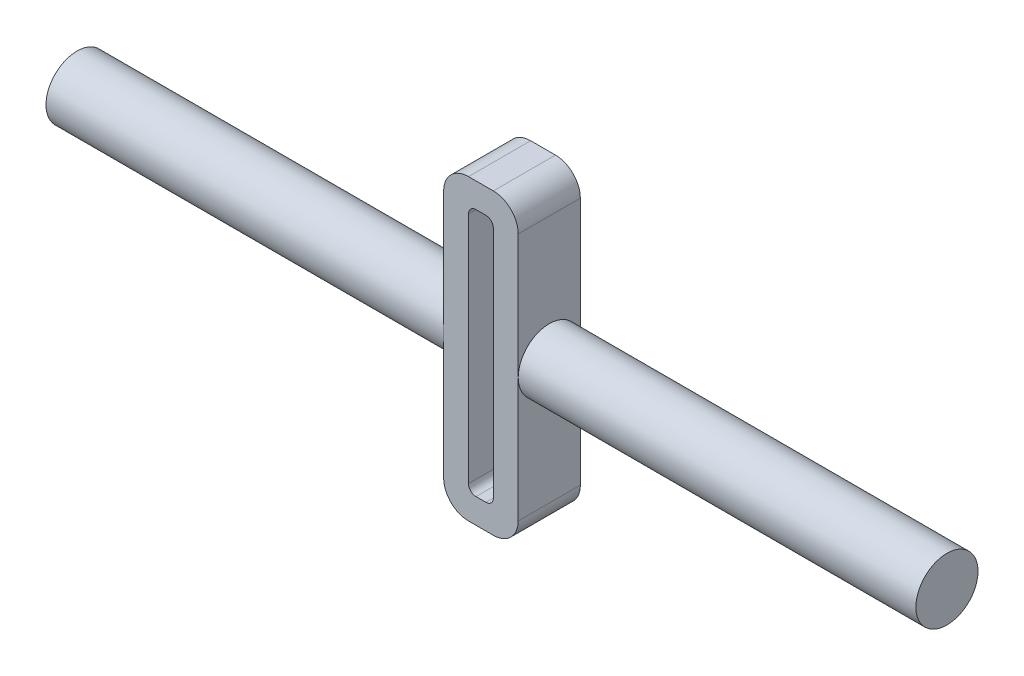
ISO-10303-21;
HEADER;
FILE_DESCRIPTION(('STEP AP214'),'2;1');
FILE_NAME('part.step','',(''),(''),'','','');
FILE_SCHEMA(('AUTOMOTIVE_DESIGN { 1 0 10303 214 1 1 1 1 }'));
ENDSEC;
DATA;
#1=APPLICATION_CONTEXT('core data for automotive mechanical design processes');
#2=APPLICATION_PROTOCOL_DEFINITION('international standard','automotive_design',2000,#1);
#3=PRODUCT_CONTEXT('',#1,'mechanical');
#4=PRODUCT('Part','Part','',(#3));
#5=PRODUCT_RELATED_PRODUCT_CATEGORY('part','',(#4));
#6=PRODUCT_DEFINITION_FORMATION('','',#4);
#7=PRODUCT_DEFINITION_CONTEXT('part definition',#1,'design');
#8=PRODUCT_DEFINITION('design','',#6,#7);
#9=PRODUCT_DEFINITION_SHAPE('','',#8);
#10=(LENGTH_UNIT() NAMED_UNIT(*) SI_UNIT(.MILLI.,.METRE.));
#11=(NAMED_UNIT(*) PLANE_ANGLE_UNIT() SI_UNIT($,.RADIAN.));
#12=(NAMED_UNIT(*) SI_UNIT($,.STERADIAN.) SOLID_ANGLE_UNIT());
#13=UNCERTAINTY_MEASURE_WITH_UNIT(LENGTH_MEASURE(1.E-05),#10,'distance_accuracy_value','');
#14=(GEOMETRIC_REPRESENTATION_CONTEXT(3) GLOBAL_UNCERTAINTY_ASSIGNED_CONTEXT((#13)) GLOBAL_UNIT_ASSIGNED_CONTEXT((#10,
#11,#12)) REPRESENTATION_CONTEXT('',''));
#15=CARTESIAN_POINT('',(0.,0.,0.));
#16=DIRECTION('',(0.,0.,1.));
#17=DIRECTION('',(1.,0.,0.));
#18=AXIS2_PLACEMENT_3D('',#15,#16,#17);
#19=CARTESIAN_POINT('',(-15.,50.,25.));
#20=DIRECTION('',(1.,0.,0.));
#21=DIRECTION('',(0.,1.,0.));
#22=AXIS2_PLACEMENT_3D('',#19,#20,#21);
#23=PLANE('',#22);
#24=DIRECTION('',(0.,-1.,0.));
#25=VECTOR('',#24,1.);
#26=CARTESIAN_POINT('',(-15.,50.,25.));
#27=LINE('',#26,#25);
#28=CARTESIAN_POINT('',(-15.,0.,25.));
#29=VERTEX_POINT('',#28);
#30=CARTESIAN_POINT('',(-15.,-50.,25.));
#31=VERTEX_POINT('',#30);
#32=EDGE_CURVE('E148',#29,#31,#27,.T.);
#33=ORIENTED_EDGE('',*,*,#32,.F.);
#34=CARTESIAN_POINT('',(-15.,0.,12.5));
#35=DIRECTION('',(1.,0.,0.));
#36=DIRECTION('',(0.,1.,0.));
#37=AXIS2_PLACEMENT_3D('',#34,#35,#36);
#38=CIRCLE('',#37,12.5);
#39=CARTESIAN_POINT('',(-15.,0.,0.));
#40=VERTEX_POINT('',#39);
#41=EDGE_CURVE('E31',#29,#40,#38,.T.);
#42=ORIENTED_EDGE('',*,*,#41,.T.);
#43=DIRECTION('',(0.,-1.,0.));
#44=VECTOR('',#43,1.);
#45=CARTESIAN_POINT('',(-15.,50.,0.));
#46=LINE('',#45,#44);
#47=CARTESIAN_POINT('',(-15.,-50.,0.));
#48=VERTEX_POINT('',#47);
#49=EDGE_CURVE('E146',#40,#48,#46,.T.);
#50=ORIENTED_EDGE('',*,*,#49,.T.);
#51=DIRECTION('',(0.,0.,-1.));
#52=VECTOR('',#51,1.);
#53=CARTESIAN_POINT('',(-15.,-50.,25.));
#54=LINE('',#53,#52);
#55=EDGE_CURVE('E182',#31,#48,#54,.T.);
#56=ORIENTED_EDGE('',*,*,#55,.F.);
#57=EDGE_LOOP('',(#33,#42,#50,#56));
#58=FACE_BOUND('',#57,.T.);
#59=ADVANCED_FACE('F17',(#58),#23,.F.);
#60=CARTESIAN_POINT('',(15.,50.,25.));
#61=DIRECTION('',(-1.,0.,0.));
#62=DIRECTION('',(0.,-1.,0.));
#63=AXIS2_PLACEMENT_3D('',#60,#61,#62);
#64=PLANE('',#63);
#65=CARTESIAN_POINT('',(15.,0.,12.5));
#66=DIRECTION('',(-1.,0.,0.));
#67=DIRECTION('',(0.,-1.,0.));
#68=AXIS2_PLACEMENT_3D('',#65,#66,#67);
#69=CIRCLE('',#68,12.5);
#70=CARTESIAN_POINT('',(15.,0.,0.));
#71=VERTEX_POINT('',#70);
#72=CARTESIAN_POINT('',(15.,0.,25.));
#73=VERTEX_POINT('',#72);
#74=EDGE_CURVE('E25',#71,#73,#69,.F.);
#75=ORIENTED_EDGE('',*,*,#74,.F.);
#76=DIRECTION('',(0.,1.,0.));
#77=VECTOR('',#76,1.);
#78=CARTESIAN_POINT('',(15.,50.,0.));
#79=LINE('',#78,#77);
#80=CARTESIAN_POINT('',(15.,50.,0.));
#81=VERTEX_POINT('',#80);
#82=EDGE_CURVE('E204',#71,#81,#79,.T.);
#83=ORIENTED_EDGE('',*,*,#82,.T.);
#84=DIRECTION('',(0.,0.,-1.));
#85=VECTOR('',#84,1.);
#86=CARTESIAN_POINT('',(15.,50.,25.));
#87=LINE('',#86,#85);
#88=CARTESIAN_POINT('',(15.,50.,25.));
#89=VERTEX_POINT('',#88);
#90=EDGE_CURVE('E191',#89,#81,#87,.T.);
#91=ORIENTED_EDGE('',*,*,#90,.F.);
#92=DIRECTION('',(0.,1.,0.));
#93=VECTOR('',#92,1.);
#94=CARTESIAN_POINT('',(15.,50.,25.));
#95=LINE('',#94,#93);
#96=EDGE_CURVE('E205',#73,#89,#95,.T.);
#97=ORIENTED_EDGE('',*,*,#96,.F.);
#98=EDGE_LOOP('',(#75,#83,#91,#97));
#99=FACE_BOUND('',#98,.T.);
#100=ADVANCED_FACE('F201',(#99),#64,.F.);
#101=CARTESIAN_POINT('',(5.,-50.,25.));
#102=DIRECTION('',(0.,0.,1.));
#103=DIRECTION('',(1.,0.,0.));
#104=AXIS2_PLACEMENT_3D('',#101,#102,#103);
#105=PLANE('',#104);
#106=CARTESIAN_POINT('',(5.,-50.,25.));
#107=DIRECTION('',(0.,0.,1.));
#108=DIRECTION('',(1.,0.,0.));
#109=AXIS2_PLACEMENT_3D('',#106,#107,#108);
#110=CIRCLE('',#109,10.);
#111=CARTESIAN_POINT('',(4.99999999999994,-60.,25.));
#112=VERTEX_POINT('',#111);
#113=CARTESIAN_POINT('',(15.,-50.,25.));
#114=VERTEX_POINT('',#113);
#115=EDGE_CURVE('E174',#112,#114,#110,.T.);
#116=ORIENTED_EDGE('',*,*,#115,.T.);
#117=EDGE_CURVE('E209',#114,#73,#95,.T.);
#118=ORIENTED_EDGE('',*,*,#117,.T.);
#119=ORIENTED_EDGE('',*,*,#96,.T.);
#120=CARTESIAN_POINT('',(5.,50.,25.));
#121=DIRECTION('',(0.,0.,1.));
#122=DIRECTION('',(1.,0.,0.));
#123=AXIS2_PLACEMENT_3D('',#120,#121,#122);
#124=CIRCLE('',#123,10.);
#125=CARTESIAN_POINT('',(4.99999999999993,60.,25.));
#126=VERTEX_POINT('',#125);
#127=EDGE_CURVE('E216',#89,#126,#124,.T.);
#128=ORIENTED_EDGE('',*,*,#127,.T.);
#129=DIRECTION('',(-1.,0.,0.));
#130=VECTOR('',#129,1.);
#131=CARTESIAN_POINT('',(-4.99999999999993,60.,25.));
#132=LINE('',#131,#130);
#133=CARTESIAN_POINT('',(-4.99999999999993,60.,25.));
#134=VERTEX_POINT('',#133);
#135=EDGE_CURVE('E217',#126,#134,#132,.T.);
#136=ORIENTED_EDGE('',*,*,#135,.T.);
#137=CARTESIAN_POINT('',(-5.,50.,25.));
#138=DIRECTION('',(0.,0.,1.));
#139=DIRECTION('',(1.,0.,0.));
#140=AXIS2_PLACEMENT_3D('',#137,#138,#139);
#141=CIRCLE('',#140,10.);
#142=CARTESIAN_POINT('',(-15.,50.,25.));
#143=VERTEX_POINT('',#142);
#144=EDGE_CURVE('E223',#134,#143,#141,.T.);
#145=ORIENTED_EDGE('',*,*,#144,.T.);
#146=EDGE_CURVE('E225',#143,#29,#27,.T.);
#147=ORIENTED_EDGE('',*,*,#146,.T.);
#148=ORIENTED_EDGE('',*,*,#32,.T.);
#149=CARTESIAN_POINT('',(-5.,-50.,25.));
#150=DIRECTION('',(0.,0.,1.));
#151=DIRECTION('',(-1.,0.,0.));
#152=AXIS2_PLACEMENT_3D('',#149,#150,#151);
#153=CIRCLE('',#152,10.);
#154=CARTESIAN_POINT('',(-4.99999999999992,-60.,25.));
#155=VERTEX_POINT('',#154);
#156=EDGE_CURVE('E227',#31,#155,#153,.T.);
#157=ORIENTED_EDGE('',*,*,#156,.T.);
#158=DIRECTION('',(1.,0.,0.));
#159=VECTOR('',#158,1.);
#160=CARTESIAN_POINT('',(-4.99999999999992,-60.,25.));
#161=LINE('',#160,#159);
#162=EDGE_CURVE('E179',#155,#112,#161,.T.);
#163=ORIENTED_EDGE('',*,*,#162,.T.);
#164=EDGE_LOOP('',(#116,#118,#119,#128,#136,#145,#147,#148,#157,#163));
#165=FACE_BOUND('',#164,.T.);
#166=DIRECTION('',(0.,1.,0.));
#167=VECTOR('',#166,1.);
#168=CARTESIAN_POINT('',(5.,47.,25.));
#169=LINE('',#168,#167);
#170=CARTESIAN_POINT('',(5.,-47.,25.));
#171=VERTEX_POINT('',#170);
#172=CARTESIAN_POINT('',(5.,47.,25.));
#173=VERTEX_POINT('',#172);
#174=EDGE_CURVE('E489',#171,#173,#169,.T.);
#175=ORIENTED_EDGE('',*,*,#174,.F.);
#176=CARTESIAN_POINT('',(2.,-47.,25.));
#177=DIRECTION('',(0.,0.,1.));
#178=DIRECTION('',(1.,0.,0.));
#179=AXIS2_PLACEMENT_3D('',#176,#177,#178);
#180=CIRCLE('',#179,3.);
#181=CARTESIAN_POINT('',(2.,-50.,25.));
#182=VERTEX_POINT('',#181);
#183=EDGE_CURVE('E487',#182,#171,#180,.T.);
#184=ORIENTED_EDGE('',*,*,#183,.F.);
#185=DIRECTION('',(1.,0.,0.));
#186=VECTOR('',#185,1.);
#187=CARTESIAN_POINT('',(-2.,-50.,25.));
#188=LINE('',#187,#186);
#189=CARTESIAN_POINT('',(-2.,-50.,25.));
#190=VERTEX_POINT('',#189);
#191=EDGE_CURVE('E503',#190,#182,#188,.T.);
#192=ORIENTED_EDGE('',*,*,#191,.F.);
#193=CARTESIAN_POINT('',(-2.,-47.,25.));
#194=DIRECTION('',(0.,0.,1.));
#195=DIRECTION('',(-1.,0.,0.));
#196=AXIS2_PLACEMENT_3D('',#193,#194,#195);
#197=CIRCLE('',#196,3.);
#198=CARTESIAN_POINT('',(-5.,-47.,25.));
#199=VERTEX_POINT('',#198);
#200=EDGE_CURVE('E500',#199,#190,#197,.T.);
#201=ORIENTED_EDGE('',*,*,#200,.F.);
#202=DIRECTION('',(0.,-1.,0.));
#203=VECTOR('',#202,1.);
#204=CARTESIAN_POINT('',(-5.,47.,25.));
#205=LINE('',#204,#203);
#206=CARTESIAN_POINT('',(-5.,47.,25.));
#207=VERTEX_POINT('',#206);
#208=EDGE_CURVE('E498',#207,#199,#205,.T.);
#209=ORIENTED_EDGE('',*,*,#208,.F.);
#210=CARTESIAN_POINT('',(-2.,47.,25.));
#211=DIRECTION('',(0.,0.,1.));
#212=DIRECTION('',(-1.,0.,0.));
#213=AXIS2_PLACEMENT_3D('',#210,#211,#212);
#214=CIRCLE('',#213,3.);
#215=CARTESIAN_POINT('',(-2.,50.,25.));
#216=VERTEX_POINT('',#215);
#217=EDGE_CURVE('E496',#216,#207,#214,.T.);
#218=ORIENTED_EDGE('',*,*,#217,.F.);
#219=DIRECTION('',(-1.,0.,0.));
#220=VECTOR('',#219,1.);
#221=CARTESIAN_POINT('',(-2.,50.,25.));
#222=LINE('',#221,#220);
#223=CARTESIAN_POINT('',(1.99999999999996,50.,25.));
#224=VERTEX_POINT('',#223);
#225=EDGE_CURVE('E494',#224,#216,#222,.T.);
#226=ORIENTED_EDGE('',*,*,#225,.F.);
#227=CARTESIAN_POINT('',(2.,47.,25.));
#228=DIRECTION('',(0.,0.,1.));
#229=DIRECTION('',(1.,0.,0.));
#230=AXIS2_PLACEMENT_3D('',#227,#228,#229);
#231=CIRCLE('',#230,3.);
#232=EDGE_CURVE('E492',#173,#224,#231,.T.);
#233=ORIENTED_EDGE('',*,*,#232,.F.);
#234=EDGE_LOOP('',(#175,#184,#192,#201,#209,#218,#226,#233));
#235=FACE_BOUND('',#234,.T.);
#236=ADVANCED_FACE('F212',(#165,#235),#105,.T.);
#237=CARTESIAN_POINT('',(5.,-50.,0.));
#238=DIRECTION('',(0.,0.,1.));
#239=DIRECTION('',(1.,0.,0.));
#240=AXIS2_PLACEMENT_3D('',#237,#238,#239);
#241=PLANE('',#240);
#242=CARTESIAN_POINT('',(5.,-50.,0.));
#243=DIRECTION('',(0.,0.,1.));
#244=DIRECTION('',(1.,0.,0.));
#245=AXIS2_PLACEMENT_3D('',#242,#243,#244);
#246=CIRCLE('',#245,10.);
#247=CARTESIAN_POINT('',(4.99999999999994,-60.,0.));
#248=VERTEX_POINT('',#247);
#249=CARTESIAN_POINT('',(15.,-50.,0.));
#250=VERTEX_POINT('',#249);
#251=EDGE_CURVE('E230',#248,#250,#246,.T.);
#252=ORIENTED_EDGE('',*,*,#251,.F.);
#253=DIRECTION('',(1.,0.,0.));
#254=VECTOR('',#253,1.);
#255=CARTESIAN_POINT('',(-4.99999999999992,-60.,0.));
#256=LINE('',#255,#254);
#257=CARTESIAN_POINT('',(-4.99999999999992,-60.,0.));
#258=VERTEX_POINT('',#257);
#259=EDGE_CURVE('E168',#258,#248,#256,.T.);
#260=ORIENTED_EDGE('',*,*,#259,.F.);
#261=CARTESIAN_POINT('',(-5.,-50.,0.));
#262=DIRECTION('',(0.,0.,1.));
#263=DIRECTION('',(-1.,0.,0.));
#264=AXIS2_PLACEMENT_3D('',#261,#262,#263);
#265=CIRCLE('',#264,10.);
#266=EDGE_CURVE('E161',#48,#258,#265,.T.);
#267=ORIENTED_EDGE('',*,*,#266,.F.);
#268=ORIENTED_EDGE('',*,*,#49,.F.);
#269=CARTESIAN_POINT('',(-15.,50.,0.));
#270=VERTEX_POINT('',#269);
#271=EDGE_CURVE('E159',#270,#40,#46,.T.);
#272=ORIENTED_EDGE('',*,*,#271,.F.);
#273=CARTESIAN_POINT('',(-5.,50.,0.));
#274=DIRECTION('',(0.,0.,1.));
#275=DIRECTION('',(1.,0.,0.));
#276=AXIS2_PLACEMENT_3D('',#273,#274,#275);
#277=CIRCLE('',#276,10.);
#278=CARTESIAN_POINT('',(-4.99999999999993,60.,0.));
#279=VERTEX_POINT('',#278);
#280=EDGE_CURVE('E162',#279,#270,#277,.T.);
#281=ORIENTED_EDGE('',*,*,#280,.F.);
#282=DIRECTION('',(-1.,0.,0.));
#283=VECTOR('',#282,1.);
#284=CARTESIAN_POINT('',(-4.99999999999993,60.,0.));
#285=LINE('',#284,#283);
#286=CARTESIAN_POINT('',(4.99999999999993,60.,0.));
#287=VERTEX_POINT('',#286);
#288=EDGE_CURVE('E237',#287,#279,#285,.T.);
#289=ORIENTED_EDGE('',*,*,#288,.F.);
#290=CARTESIAN_POINT('',(5.,50.,0.));
#291=DIRECTION('',(0.,0.,1.));
#292=DIRECTION('',(1.,0.,0.));
#293=AXIS2_PLACEMENT_3D('',#290,#291,#292);
#294=CIRCLE('',#293,10.);
#295=EDGE_CURVE('E236',#81,#287,#294,.T.);
#296=ORIENTED_EDGE('',*,*,#295,.F.);
#297=ORIENTED_EDGE('',*,*,#82,.F.);
#298=EDGE_CURVE('E234',#250,#71,#79,.T.);
#299=ORIENTED_EDGE('',*,*,#298,.F.);
#300=EDGE_LOOP('',(#252,#260,#267,#268,#272,#281,#289,#296,#297,#299));
#301=FACE_BOUND('',#300,.T.);
#302=CARTESIAN_POINT('',(2.,-47.,0.));
#303=DIRECTION('',(0.,0.,1.));
#304=DIRECTION('',(1.,0.,0.));
#305=AXIS2_PLACEMENT_3D('',#302,#303,#304);
#306=CIRCLE('',#305,3.);
#307=CARTESIAN_POINT('',(2.,-50.,0.));
#308=VERTEX_POINT('',#307);
#309=CARTESIAN_POINT('',(5.,-47.,0.));
#310=VERTEX_POINT('',#309);
#311=EDGE_CURVE('E485',#308,#310,#306,.T.);
#312=ORIENTED_EDGE('',*,*,#311,.T.);
#313=DIRECTION('',(0.,1.,0.));
#314=VECTOR('',#313,1.);
#315=CARTESIAN_POINT('',(5.,47.,0.));
#316=LINE('',#315,#314);
#317=CARTESIAN_POINT('',(5.,47.,0.));
#318=VERTEX_POINT('',#317);
#319=EDGE_CURVE('E508',#310,#318,#316,.T.);
#320=ORIENTED_EDGE('',*,*,#319,.T.);
#321=CARTESIAN_POINT('',(2.,47.,0.));
#322=DIRECTION('',(0.,0.,1.));
#323=DIRECTION('',(1.,0.,0.));
#324=AXIS2_PLACEMENT_3D('',#321,#322,#323);
#325=CIRCLE('',#324,3.);
#326=CARTESIAN_POINT('',(1.99999999999996,50.,0.));
#327=VERTEX_POINT('',#326);
#328=EDGE_CURVE('E511',#318,#327,#325,.T.);
#329=ORIENTED_EDGE('',*,*,#328,.T.);
#330=DIRECTION('',(-1.,0.,0.));
#331=VECTOR('',#330,1.);
#332=CARTESIAN_POINT('',(-2.,50.,0.));
#333=LINE('',#332,#331);
#334=CARTESIAN_POINT('',(-2.,50.,0.));
#335=VERTEX_POINT('',#334);
#336=EDGE_CURVE('E514',#327,#335,#333,.T.);
#337=ORIENTED_EDGE('',*,*,#336,.T.);
#338=CARTESIAN_POINT('',(-2.,47.,0.));
#339=DIRECTION('',(0.,0.,1.));
#340=DIRECTION('',(-1.,0.,0.));
#341=AXIS2_PLACEMENT_3D('',#338,#339,#340);
#342=CIRCLE('',#341,3.);
#343=CARTESIAN_POINT('',(-5.,47.,0.));
#344=VERTEX_POINT('',#343);
#345=EDGE_CURVE('E517',#335,#344,#342,.T.);
#346=ORIENTED_EDGE('',*,*,#345,.T.);
#347=DIRECTION('',(0.,-1.,0.));
#348=VECTOR('',#347,1.);
#349=CARTESIAN_POINT('',(-5.,47.,0.));
#350=LINE('',#349,#348);
#351=CARTESIAN_POINT('',(-5.,-47.,0.));
#352=VERTEX_POINT('',#351);
#353=EDGE_CURVE('E520',#344,#352,#350,.T.);
#354=ORIENTED_EDGE('',*,*,#353,.T.);
#355=CARTESIAN_POINT('',(-2.,-47.,0.));
#356=DIRECTION('',(0.,0.,1.));
#357=DIRECTION('',(-1.,0.,0.));
#358=AXIS2_PLACEMENT_3D('',#355,#356,#357);
#359=CIRCLE('',#358,3.);
#360=CARTESIAN_POINT('',(-2.,-50.,0.));
#361=VERTEX_POINT('',#360);
#362=EDGE_CURVE('E523',#352,#361,#359,.T.);
#363=ORIENTED_EDGE('',*,*,#362,.T.);
#364=DIRECTION('',(1.,0.,0.));
#365=VECTOR('',#364,1.);
#366=CARTESIAN_POINT('',(-2.,-50.,0.));
#367=LINE('',#366,#365);
#368=EDGE_CURVE('E490',#361,#308,#367,.T.);
#369=ORIENTED_EDGE('',*,*,#368,.T.);
#370=EDGE_LOOP('',(#312,#320,#329,#337,#346,#354,#363,#369));
#371=FACE_BOUND('',#370,.T.);
#372=ADVANCED_FACE('F156',(#301,#371),#241,.F.);
#373=CARTESIAN_POINT('',(5.,-50.,25.));
#374=DIRECTION('',(0.,0.,-1.));
#375=DIRECTION('',(-1.,0.,0.));
#376=AXIS2_PLACEMENT_3D('',#373,#374,#375);
#377=CYLINDRICAL_SURFACE('',#376,10.);
#378=ORIENTED_EDGE('',*,*,#251,.T.);
#379=DIRECTION('',(0.,0.,-1.));
#380=VECTOR('',#379,1.);
#381=CARTESIAN_POINT('',(15.,-50.,25.));
#382=LINE('',#381,#380);
#383=EDGE_CURVE('E194',#114,#250,#382,.T.);
#384=ORIENTED_EDGE('',*,*,#383,.F.);
#385=ORIENTED_EDGE('',*,*,#115,.F.);
#386=DIRECTION('',(0.,0.,-1.));
#387=VECTOR('',#386,1.);
#388=CARTESIAN_POINT('',(4.99999999999994,-60.,25.));
#389=LINE('',#388,#387);
#390=EDGE_CURVE('E175',#112,#248,#389,.T.);
#391=ORIENTED_EDGE('',*,*,#390,.T.);
#392=EDGE_LOOP('',(#378,#384,#385,#391));
#393=FACE_BOUND('',#392,.T.);
#394=ADVANCED_FACE('F19',(#393),#377,.T.);
#395=CARTESIAN_POINT('',(15.,0.,12.5));
#396=DIRECTION('',(1.,0.,0.));
#397=DIRECTION('',(0.,1.,0.));
#398=AXIS2_PLACEMENT_3D('',#395,#396,#397);
#399=CIRCLE('',#398,12.5);
#400=EDGE_CURVE('E38',#73,#71,#399,.T.);
#401=ORIENTED_EDGE('',*,*,#400,.F.);
#402=ORIENTED_EDGE('',*,*,#117,.F.);
#403=ORIENTED_EDGE('',*,*,#383,.T.);
#404=ORIENTED_EDGE('',*,*,#298,.T.);
#405=EDGE_LOOP('',(#401,#402,#403,#404));
#406=FACE_BOUND('',#405,.T.);
#407=ADVANCED_FACE('F259',(#406),#64,.F.);
#408=CARTESIAN_POINT('',(5.,50.,25.));
#409=DIRECTION('',(0.,0.,-1.));
#410=DIRECTION('',(-1.,0.,0.));
#411=AXIS2_PLACEMENT_3D('',#408,#409,#410);
#412=CYLINDRICAL_SURFACE('',#411,10.);
#413=ORIENTED_EDGE('',*,*,#295,.T.);
#414=DIRECTION('',(0.,0.,-1.));
#415=VECTOR('',#414,1.);
#416=CARTESIAN_POINT('',(4.99999999999993,60.,25.));
#417=LINE('',#416,#415);
#418=EDGE_CURVE('E188',#126,#287,#417,.T.);
#419=ORIENTED_EDGE('',*,*,#418,.F.);
#420=ORIENTED_EDGE('',*,*,#127,.F.);
#421=ORIENTED_EDGE('',*,*,#90,.T.);
#422=EDGE_LOOP('',(#413,#419,#420,#421));
#423=FACE_BOUND('',#422,.T.);
#424=ADVANCED_FACE('F247',(#423),#412,.T.);
#425=CARTESIAN_POINT('',(-4.99999999999993,60.,25.));
#426=DIRECTION('',(0.,-1.,0.));
#427=DIRECTION('',(0.,0.,-1.));
#428=AXIS2_PLACEMENT_3D('',#425,#426,#427);
#429=PLANE('',#428);
#430=ORIENTED_EDGE('',*,*,#288,.T.);
#431=DIRECTION('',(0.,0.,-1.));
#432=VECTOR('',#431,1.);
#433=CARTESIAN_POINT('',(-4.99999999999993,60.,25.));
#434=LINE('',#433,#432);
#435=EDGE_CURVE('E185',#134,#279,#434,.T.);
#436=ORIENTED_EDGE('',*,*,#435,.F.);
#437=ORIENTED_EDGE('',*,*,#135,.F.);
#438=ORIENTED_EDGE('',*,*,#418,.T.);
#439=EDGE_LOOP('',(#430,#436,#437,#438));
#440=FACE_BOUND('',#439,.T.);
#441=ADVANCED_FACE('F249',(#440),#429,.F.);
#442=CARTESIAN_POINT('',(-5.,50.,25.));
#443=DIRECTION('',(0.,0.,-1.));
#444=DIRECTION('',(-1.,0.,0.));
#445=AXIS2_PLACEMENT_3D('',#442,#443,#444);
#446=CYLINDRICAL_SURFACE('',#445,10.);
#447=ORIENTED_EDGE('',*,*,#280,.T.);
#448=DIRECTION('',(0.,0.,-1.));
#449=VECTOR('',#448,1.);
#450=CARTESIAN_POINT('',(-15.,50.,25.));
#451=LINE('',#450,#449);
#452=EDGE_CURVE('E167',#143,#270,#451,.T.);
#453=ORIENTED_EDGE('',*,*,#452,.F.);
#454=ORIENTED_EDGE('',*,*,#144,.F.);
#455=ORIENTED_EDGE('',*,*,#435,.T.);
#456=EDGE_LOOP('',(#447,#453,#454,#455));
#457=FACE_BOUND('',#456,.T.);
#458=ADVANCED_FACE('F242',(#457),#446,.T.);
#459=ORIENTED_EDGE('',*,*,#271,.T.);
#460=CARTESIAN_POINT('',(-15.,0.,12.5));
#461=DIRECTION('',(1.,0.,0.));
#462=DIRECTION('',(0.,1.,0.));
#463=AXIS2_PLACEMENT_3D('',#460,#461,#462);
#464=CIRCLE('',#463,12.5);
#465=EDGE_CURVE('E11',#40,#29,#464,.T.);
#466=ORIENTED_EDGE('',*,*,#465,.T.);
#467=ORIENTED_EDGE('',*,*,#146,.F.);
#468=ORIENTED_EDGE('',*,*,#452,.T.);
#469=EDGE_LOOP('',(#459,#466,#467,#468));
#470=FACE_BOUND('',#469,.T.);
#471=ADVANCED_FACE('F165',(#470),#23,.F.);
#472=CARTESIAN_POINT('',(-5.,-50.,25.));
#473=DIRECTION('',(0.,0.,-1.));
#474=DIRECTION('',(-1.,0.,0.));
#475=AXIS2_PLACEMENT_3D('',#472,#473,#474);
#476=CYLINDRICAL_SURFACE('',#475,10.);
#477=ORIENTED_EDGE('',*,*,#266,.T.);
#478=DIRECTION('',(0.,0.,-1.));
#479=VECTOR('',#478,1.);
#480=CARTESIAN_POINT('',(-4.99999999999992,-60.,25.));
#481=LINE('',#480,#479);
#482=EDGE_CURVE('E178',#155,#258,#481,.T.);
#483=ORIENTED_EDGE('',*,*,#482,.F.);
#484=ORIENTED_EDGE('',*,*,#156,.F.);
#485=ORIENTED_EDGE('',*,*,#55,.T.);
#486=EDGE_LOOP('',(#477,#483,#484,#485));
#487=FACE_BOUND('',#486,.T.);
#488=ADVANCED_FACE('F253',(#487),#476,.T.);
#489=CARTESIAN_POINT('',(-4.99999999999992,-60.,25.));
#490=DIRECTION('',(0.,1.,0.));
#491=DIRECTION('',(0.,0.,1.));
#492=AXIS2_PLACEMENT_3D('',#489,#490,#491);
#493=PLANE('',#492);
#494=ORIENTED_EDGE('',*,*,#259,.T.);
#495=ORIENTED_EDGE('',*,*,#390,.F.);
#496=ORIENTED_EDGE('',*,*,#162,.F.);
#497=ORIENTED_EDGE('',*,*,#482,.T.);
#498=EDGE_LOOP('',(#494,#495,#496,#497));
#499=FACE_BOUND('',#498,.T.);
#500=ADVANCED_FACE('F257',(#499),#493,.F.);
#501=CARTESIAN_POINT('',(2.,-47.,25.));
#502=DIRECTION('',(0.,0.,-1.));
#503=DIRECTION('',(-1.,0.,0.));
#504=AXIS2_PLACEMENT_3D('',#501,#502,#503);
#505=CYLINDRICAL_SURFACE('',#504,3.);
#506=ORIENTED_EDGE('',*,*,#311,.F.);
#507=DIRECTION('',(0.,0.,-1.));
#508=VECTOR('',#507,1.);
#509=CARTESIAN_POINT('',(2.,-50.,25.));
#510=LINE('',#509,#508);
#511=EDGE_CURVE('E505',#182,#308,#510,.T.);
#512=ORIENTED_EDGE('',*,*,#511,.F.);
#513=ORIENTED_EDGE('',*,*,#183,.T.);
#514=DIRECTION('',(0.,0.,-1.));
#515=VECTOR('',#514,1.);
#516=CARTESIAN_POINT('',(5.,-47.,25.));
#517=LINE('',#516,#515);
#518=EDGE_CURVE('E233',#171,#310,#517,.T.);
#519=ORIENTED_EDGE('',*,*,#518,.T.);
#520=EDGE_LOOP('',(#506,#512,#513,#519));
#521=FACE_BOUND('',#520,.T.);
#522=ADVANCED_FACE('F357',(#521),#505,.F.);
#523=CARTESIAN_POINT('',(5.,47.,25.));
#524=DIRECTION('',(-1.,0.,0.));
#525=DIRECTION('',(0.,-1.,0.));
#526=AXIS2_PLACEMENT_3D('',#523,#524,#525);
#527=PLANE('',#526);
#528=ORIENTED_EDGE('',*,*,#319,.F.);
#529=ORIENTED_EDGE('',*,*,#518,.F.);
#530=ORIENTED_EDGE('',*,*,#174,.T.);
#531=DIRECTION('',(0.,0.,-1.));
#532=VECTOR('',#531,1.);
#533=CARTESIAN_POINT('',(5.,47.,25.));
#534=LINE('',#533,#532);
#535=EDGE_CURVE('E540',#173,#318,#534,.T.);
#536=ORIENTED_EDGE('',*,*,#535,.T.);
#537=EDGE_LOOP('',(#528,#529,#530,#536));
#538=FACE_BOUND('',#537,.T.);
#539=ADVANCED_FACE('F366',(#538),#527,.T.);
#540=CARTESIAN_POINT('',(2.,47.,25.));
#541=DIRECTION('',(0.,0.,-1.));
#542=DIRECTION('',(-1.,0.,0.));
#543=AXIS2_PLACEMENT_3D('',#540,#541,#542);
#544=CYLINDRICAL_SURFACE('',#543,3.);
#545=ORIENTED_EDGE('',*,*,#328,.F.);
#546=ORIENTED_EDGE('',*,*,#535,.F.);
#547=ORIENTED_EDGE('',*,*,#232,.T.);
#548=DIRECTION('',(0.,0.,-1.));
#549=VECTOR('',#548,1.);
#550=CARTESIAN_POINT('',(1.99999999999996,50.,25.));
#551=LINE('',#550,#549);
#552=EDGE_CURVE('E538',#224,#327,#551,.T.);
#553=ORIENTED_EDGE('',*,*,#552,.T.);
#554=EDGE_LOOP('',(#545,#546,#547,#553));
#555=FACE_BOUND('',#554,.T.);
#556=ADVANCED_FACE('F376',(#555),#544,.F.);
#557=CARTESIAN_POINT('',(-2.,50.,25.));
#558=DIRECTION('',(0.,-1.,0.));
#559=DIRECTION('',(0.,0.,-1.));
#560=AXIS2_PLACEMENT_3D('',#557,#558,#559);
#561=PLANE('',#560);
#562=ORIENTED_EDGE('',*,*,#336,.F.);
#563=ORIENTED_EDGE('',*,*,#552,.F.);
#564=ORIENTED_EDGE('',*,*,#225,.T.);
#565=DIRECTION('',(0.,0.,-1.));
#566=VECTOR('',#565,1.);
#567=CARTESIAN_POINT('',(-2.,50.,25.));
#568=LINE('',#567,#566);
#569=EDGE_CURVE('E536',#216,#335,#568,.T.);
#570=ORIENTED_EDGE('',*,*,#569,.T.);
#571=EDGE_LOOP('',(#562,#563,#564,#570));
#572=FACE_BOUND('',#571,.T.);
#573=ADVANCED_FACE('F387',(#572),#561,.T.);
#574=CARTESIAN_POINT('',(-2.,47.,25.));
#575=DIRECTION('',(0.,0.,-1.));
#576=DIRECTION('',(-1.,0.,0.));
#577=AXIS2_PLACEMENT_3D('',#574,#575,#576);
#578=CYLINDRICAL_SURFACE('',#577,3.);
#579=ORIENTED_EDGE('',*,*,#345,.F.);
#580=ORIENTED_EDGE('',*,*,#569,.F.);
#581=ORIENTED_EDGE('',*,*,#217,.T.);
#582=DIRECTION('',(0.,0.,-1.));
#583=VECTOR('',#582,1.);
#584=CARTESIAN_POINT('',(-5.,47.,25.));
#585=LINE('',#584,#583);
#586=EDGE_CURVE('E534',#207,#344,#585,.T.);
#587=ORIENTED_EDGE('',*,*,#586,.T.);
#588=EDGE_LOOP('',(#579,#580,#581,#587));
#589=FACE_BOUND('',#588,.T.);
#590=ADVANCED_FACE('F397',(#589),#578,.F.);
#591=CARTESIAN_POINT('',(-5.,47.,25.));
#592=DIRECTION('',(1.,0.,0.));
#593=DIRECTION('',(0.,1.,0.));
#594=AXIS2_PLACEMENT_3D('',#591,#592,#593);
#595=PLANE('',#594);
#596=ORIENTED_EDGE('',*,*,#353,.F.);
#597=ORIENTED_EDGE('',*,*,#586,.F.);
#598=ORIENTED_EDGE('',*,*,#208,.T.);
#599=DIRECTION('',(0.,0.,-1.));
#600=VECTOR('',#599,1.);
#601=CARTESIAN_POINT('',(-5.,-47.,25.));
#602=LINE('',#601,#600);
#603=EDGE_CURVE('E532',#199,#352,#602,.T.);
#604=ORIENTED_EDGE('',*,*,#603,.T.);
#605=EDGE_LOOP('',(#596,#597,#598,#604));
#606=FACE_BOUND('',#605,.T.);
#607=ADVANCED_FACE('F407',(#606),#595,.T.);
#608=CARTESIAN_POINT('',(-2.,-47.,25.));
#609=DIRECTION('',(0.,0.,-1.));
#610=DIRECTION('',(-1.,0.,0.));
#611=AXIS2_PLACEMENT_3D('',#608,#609,#610);
#612=CYLINDRICAL_SURFACE('',#611,3.);
#613=ORIENTED_EDGE('',*,*,#362,.F.);
#614=ORIENTED_EDGE('',*,*,#603,.F.);
#615=ORIENTED_EDGE('',*,*,#200,.T.);
#616=DIRECTION('',(0.,0.,-1.));
#617=VECTOR('',#616,1.);
#618=CARTESIAN_POINT('',(-2.,-50.,25.));
#619=LINE('',#618,#617);
#620=EDGE_CURVE('E530',#190,#361,#619,.T.);
#621=ORIENTED_EDGE('',*,*,#620,.T.);
#622=EDGE_LOOP('',(#613,#614,#615,#621));
#623=FACE_BOUND('',#622,.T.);
#624=ADVANCED_FACE('F417',(#623),#612,.F.);
#625=CARTESIAN_POINT('',(-2.,-50.,25.));
#626=DIRECTION('',(0.,1.,0.));
#627=DIRECTION('',(0.,0.,1.));
#628=AXIS2_PLACEMENT_3D('',#625,#626,#627);
#629=PLANE('',#628);
#630=ORIENTED_EDGE('',*,*,#368,.F.);
#631=ORIENTED_EDGE('',*,*,#620,.F.);
#632=ORIENTED_EDGE('',*,*,#191,.T.);
#633=ORIENTED_EDGE('',*,*,#511,.T.);
#634=EDGE_LOOP('',(#630,#631,#632,#633));
#635=FACE_BOUND('',#634,.T.);
#636=ADVANCED_FACE('F427',(#635),#629,.T.);
#637=CARTESIAN_POINT('',(175.,0.,12.5));
#638=DIRECTION('',(-1.,0.,0.));
#639=DIRECTION('',(0.,-1.,0.));
#640=AXIS2_PLACEMENT_3D('',#637,#638,#639);
#641=CYLINDRICAL_SURFACE('',#640,12.5);
#642=CARTESIAN_POINT('',(175.,0.,12.5));
#643=DIRECTION('',(1.,0.,0.));
#644=DIRECTION('',(0.,1.,0.));
#645=AXIS2_PLACEMENT_3D('',#642,#643,#644);
#646=CIRCLE('',#645,12.5);
#647=CARTESIAN_POINT('',(175.,12.5,12.5));
#648=VERTEX_POINT('',#647);
#649=EDGE_CURVE('E481',#648,#648,#646,.T.);
#650=ORIENTED_EDGE('',*,*,#649,.F.);
#651=EDGE_LOOP('',(#650));
#652=FACE_BOUND('',#651,.T.);
#653=ORIENTED_EDGE('',*,*,#400,.T.);
#654=ORIENTED_EDGE('',*,*,#74,.T.);
#655=EDGE_LOOP('',(#653,#654));
#656=FACE_BOUND('',#655,.T.);
#657=ADVANCED_FACE('F199',(#652,#656),#641,.T.);
#658=CARTESIAN_POINT('',(175.,0.,12.5));
#659=DIRECTION('',(1.,0.,0.));
#660=DIRECTION('',(0.,1.,0.));
#661=AXIS2_PLACEMENT_3D('',#658,#659,#660);
#662=PLANE('',#661);
#663=ORIENTED_EDGE('',*,*,#649,.T.);
#664=EDGE_LOOP('',(#663));
#665=FACE_BOUND('',#664,.T.);
#666=ADVANCED_FACE('F446',(#665),#662,.T.);
#667=CARTESIAN_POINT('',(-175.,0.,12.5));
#668=DIRECTION('',(1.,0.,0.));
#669=DIRECTION('',(0.,1.,0.));
#670=AXIS2_PLACEMENT_3D('',#667,#668,#669);
#671=CYLINDRICAL_SURFACE('',#670,12.5);
#672=CARTESIAN_POINT('',(-175.,0.,12.5));
#673=DIRECTION('',(1.,0.,0.));
#674=DIRECTION('',(0.,1.,0.));
#675=AXIS2_PLACEMENT_3D('',#672,#673,#674);
#676=CIRCLE('',#675,12.5);
#677=CARTESIAN_POINT('',(-175.,12.5,12.5));
#678=VERTEX_POINT('',#677);
#679=EDGE_CURVE('E150',#678,#678,#676,.T.);
#680=ORIENTED_EDGE('',*,*,#679,.T.);
#681=EDGE_LOOP('',(#680));
#682=FACE_BOUND('',#681,.T.);
#683=ORIENTED_EDGE('',*,*,#41,.F.);
#684=ORIENTED_EDGE('',*,*,#465,.F.);
#685=EDGE_LOOP('',(#683,#684));
#686=FACE_BOUND('',#685,.T.);
#687=ADVANCED_FACE('F138',(#682,#686),#671,.T.);
#688=CARTESIAN_POINT('',(-175.,0.,12.5));
#689=DIRECTION('',(-1.,0.,0.));
#690=DIRECTION('',(0.,1.,0.));
#691=AXIS2_PLACEMENT_3D('',#688,#689,#690);
#692=PLANE('',#691);
#693=ORIENTED_EDGE('',*,*,#679,.F.);
#694=EDGE_LOOP('',(#693));
#695=FACE_BOUND('',#694,.T.);
#696=ADVANCED_FACE('F465',(#695),#692,.T.);
#697=CLOSED_SHELL('',(#59,#100,#236,#372,#394,#407,#424,#441,#458,#471,#488,#500,#522,#539,#556,
#573,#590,#607,#624,#636,#657,#666,#687,#696));
#698=MANIFOLD_SOLID_BREP('B1',#697);
#699=ADVANCED_BREP_SHAPE_REPRESENTATION('',(#18,#698),#14);
#700=SHAPE_DEFINITION_REPRESENTATION(#9,#699);
ENDSEC;
END-ISO-10303-21;
